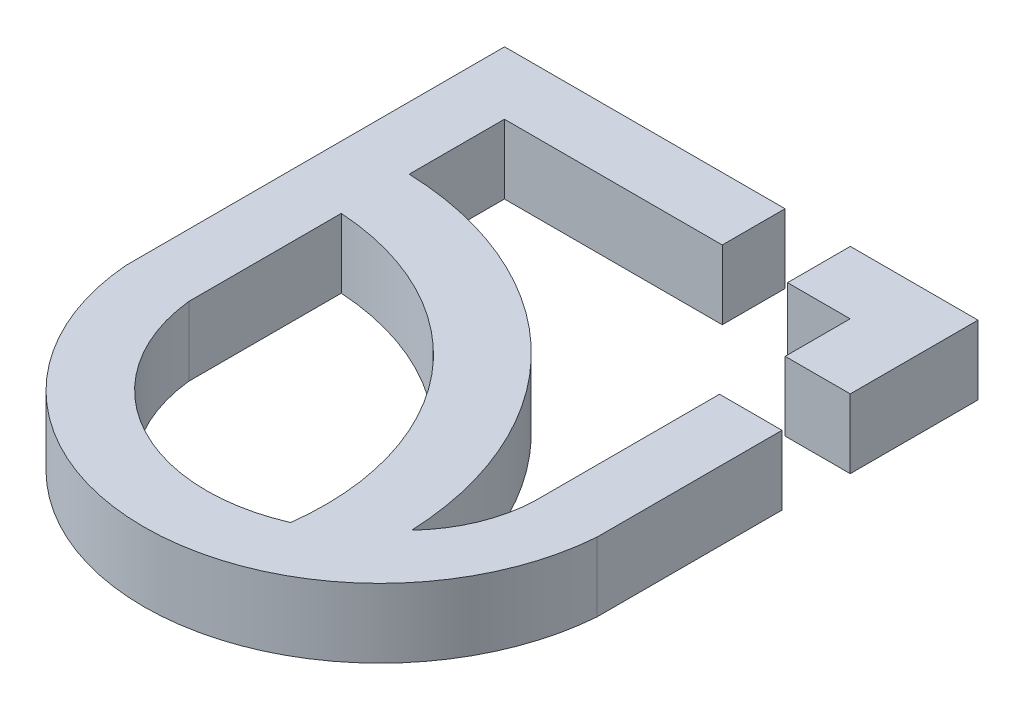
ISO-10303-21;
HEADER;
FILE_DESCRIPTION(('STEP AP214'),'2;1');
FILE_NAME('part.step','',(''),(''),'','','');
FILE_SCHEMA(('AUTOMOTIVE_DESIGN { 1 0 10303 214 1 1 1 1 }'));
ENDSEC;
DATA;
#1=APPLICATION_CONTEXT('core data for automotive mechanical design processes');
#2=APPLICATION_PROTOCOL_DEFINITION('international standard','automotive_design',2000,#1);
#3=PRODUCT_CONTEXT('',#1,'mechanical');
#4=PRODUCT('Part','Part','',(#3));
#5=PRODUCT_RELATED_PRODUCT_CATEGORY('part','',(#4));
#6=PRODUCT_DEFINITION_FORMATION('','',#4);
#7=PRODUCT_DEFINITION_CONTEXT('part definition',#1,'design');
#8=PRODUCT_DEFINITION('design','',#6,#7);
#9=PRODUCT_DEFINITION_SHAPE('','',#8);
#10=(LENGTH_UNIT() NAMED_UNIT(*) SI_UNIT(.MILLI.,.METRE.));
#11=(NAMED_UNIT(*) PLANE_ANGLE_UNIT() SI_UNIT($,.RADIAN.));
#12=(NAMED_UNIT(*) SI_UNIT($,.STERADIAN.) SOLID_ANGLE_UNIT());
#13=UNCERTAINTY_MEASURE_WITH_UNIT(LENGTH_MEASURE(1.E-05),#10,'distance_accuracy_value','');
#14=(GEOMETRIC_REPRESENTATION_CONTEXT(3) GLOBAL_UNCERTAINTY_ASSIGNED_CONTEXT((#13)) GLOBAL_UNIT_ASSIGNED_CONTEXT((#10,
#11,#12)) REPRESENTATION_CONTEXT('',''));
#15=CARTESIAN_POINT('',(0.,0.,0.));
#16=DIRECTION('',(0.,0.,1.));
#17=DIRECTION('',(1.,0.,0.));
#18=AXIS2_PLACEMENT_3D('',#15,#16,#17);
#19=CARTESIAN_POINT('',(127.017693124665,25.4,-195.999460881352));
#20=DIRECTION('',(1.,0.,0.));
#21=DIRECTION('',(0.,0.,-1.));
#22=AXIS2_PLACEMENT_3D('',#19,#20,#21);
#23=PLANE('',#22);
#24=DIRECTION('',(0.,0.,1.));
#25=VECTOR('',#24,1.);
#26=CARTESIAN_POINT('',(127.017693124665,0.,-195.999460881352));
#27=LINE('',#26,#25);
#28=CARTESIAN_POINT('',(127.017693124665,0.,-219.067642019415));
#29=VERTEX_POINT('',#28);
#30=CARTESIAN_POINT('',(127.017693124665,0.,-195.999460881352));
#31=VERTEX_POINT('',#30);
#32=EDGE_CURVE('E132',#29,#31,#27,.T.);
#33=ORIENTED_EDGE('',*,*,#32,.T.);
#34=DIRECTION('',(0.,-1.,0.));
#35=VECTOR('',#34,1.);
#36=CARTESIAN_POINT('',(127.017693124665,25.4,-195.999460881352));
#37=LINE('',#36,#35);
#38=CARTESIAN_POINT('',(127.017693124665,25.4,-195.999460881352));
#39=VERTEX_POINT('',#38);
#40=EDGE_CURVE('E12',#39,#31,#37,.T.);
#41=ORIENTED_EDGE('',*,*,#40,.F.);
#42=DIRECTION('',(0.,0.,1.));
#43=VECTOR('',#42,1.);
#44=CARTESIAN_POINT('',(127.017693124665,25.4,-195.999460881352));
#45=LINE('',#44,#43);
#46=CARTESIAN_POINT('',(127.017693124665,25.4,-219.067642019415));
#47=VERTEX_POINT('',#46);
#48=EDGE_CURVE('E142',#47,#39,#45,.T.);
#49=ORIENTED_EDGE('',*,*,#48,.F.);
#50=DIRECTION('',(0.,-1.,0.));
#51=VECTOR('',#50,1.);
#52=CARTESIAN_POINT('',(127.017693124665,25.4,-219.067642019415));
#53=LINE('',#52,#51);
#54=EDGE_CURVE('E128',#47,#29,#53,.T.);
#55=ORIENTED_EDGE('',*,*,#54,.T.);
#56=EDGE_LOOP('',(#33,#41,#49,#55));
#57=FACE_BOUND('',#56,.T.);
#58=ADVANCED_FACE('F48',(#57),#23,.F.);
#59=CARTESIAN_POINT('',(127.017693124665,25.4,-195.999460881352));
#60=DIRECTION('',(0.,0.,-1.));
#61=DIRECTION('',(-1.,0.,0.));
#62=AXIS2_PLACEMENT_3D('',#59,#60,#61);
#63=PLANE('',#62);
#64=DIRECTION('',(1.,0.,0.));
#65=VECTOR('',#64,1.);
#66=CARTESIAN_POINT('',(127.017693124665,0.,-195.999460881352));
#67=LINE('',#66,#65);
#68=CARTESIAN_POINT('',(150.026111112882,0.,-195.999460881352));
#69=VERTEX_POINT('',#68);
#70=EDGE_CURVE('E135',#31,#69,#67,.T.);
#71=ORIENTED_EDGE('',*,*,#70,.T.);
#72=DIRECTION('',(0.,-1.,0.));
#73=VECTOR('',#72,1.);
#74=CARTESIAN_POINT('',(150.026111112882,25.4,-195.999460881352));
#75=LINE('',#74,#73);
#76=CARTESIAN_POINT('',(150.026111112882,25.4,-195.999460881352));
#77=VERTEX_POINT('',#76);
#78=EDGE_CURVE('E56',#77,#69,#75,.T.);
#79=ORIENTED_EDGE('',*,*,#78,.F.);
#80=DIRECTION('',(1.,0.,0.));
#81=VECTOR('',#80,1.);
#82=CARTESIAN_POINT('',(127.017693124665,25.4,-195.999460881352));
#83=LINE('',#82,#81);
#84=EDGE_CURVE('E101',#39,#77,#83,.T.);
#85=ORIENTED_EDGE('',*,*,#84,.F.);
#86=ORIENTED_EDGE('',*,*,#40,.T.);
#87=EDGE_LOOP('',(#71,#79,#85,#86));
#88=FACE_BOUND('',#87,.T.);
#89=ADVANCED_FACE('F166',(#88),#63,.F.);
#90=CARTESIAN_POINT('',(150.026111112882,25.4,-172.13008551475));
#91=DIRECTION('',(1.,0.,0.));
#92=DIRECTION('',(0.,0.,-1.));
#93=AXIS2_PLACEMENT_3D('',#90,#91,#92);
#94=PLANE('',#93);
#95=DIRECTION('',(0.,0.,1.));
#96=VECTOR('',#95,1.);
#97=CARTESIAN_POINT('',(150.026111112882,0.,-172.13008551475));
#98=LINE('',#97,#96);
#99=CARTESIAN_POINT('',(150.026111112882,0.,-172.13008551475));
#100=VERTEX_POINT('',#99);
#101=EDGE_CURVE('E137',#69,#100,#98,.T.);
#102=ORIENTED_EDGE('',*,*,#101,.T.);
#103=DIRECTION('',(0.,-1.,0.));
#104=VECTOR('',#103,1.);
#105=CARTESIAN_POINT('',(150.026111112882,25.4,-172.13008551475));
#106=LINE('',#105,#104);
#107=CARTESIAN_POINT('',(150.026111112882,25.4,-172.13008551475));
#108=VERTEX_POINT('',#107);
#109=EDGE_CURVE('E123',#108,#100,#106,.T.);
#110=ORIENTED_EDGE('',*,*,#109,.F.);
#111=DIRECTION('',(0.,0.,1.));
#112=VECTOR('',#111,1.);
#113=CARTESIAN_POINT('',(150.026111112882,25.4,-172.13008551475));
#114=LINE('',#113,#112);
#115=EDGE_CURVE('E114',#77,#108,#114,.T.);
#116=ORIENTED_EDGE('',*,*,#115,.F.);
#117=ORIENTED_EDGE('',*,*,#78,.T.);
#118=EDGE_LOOP('',(#102,#110,#116,#117));
#119=FACE_BOUND('',#118,.T.);
#120=ADVANCED_FACE('F148',(#119),#94,.F.);
#121=CARTESIAN_POINT('',(173.927929859074,25.4,-172.13008551475));
#122=DIRECTION('',(0.,0.,-1.));
#123=DIRECTION('',(-1.,0.,0.));
#124=AXIS2_PLACEMENT_3D('',#121,#122,#123);
#125=PLANE('',#124);
#126=DIRECTION('',(1.,0.,0.));
#127=VECTOR('',#126,1.);
#128=CARTESIAN_POINT('',(173.927929859074,0.,-172.13008551475));
#129=LINE('',#128,#127);
#130=CARTESIAN_POINT('',(173.927929859074,0.,-172.13008551475));
#131=VERTEX_POINT('',#130);
#132=EDGE_CURVE('E122',#100,#131,#129,.T.);
#133=ORIENTED_EDGE('',*,*,#132,.T.);
#134=DIRECTION('',(0.,-1.,0.));
#135=VECTOR('',#134,1.);
#136=CARTESIAN_POINT('',(173.927929859074,25.4,-172.13008551475));
#137=LINE('',#136,#135);
#138=CARTESIAN_POINT('',(173.927929859074,25.4,-172.13008551475));
#139=VERTEX_POINT('',#138);
#140=EDGE_CURVE('E119',#139,#131,#137,.T.);
#141=ORIENTED_EDGE('',*,*,#140,.F.);
#142=DIRECTION('',(1.,0.,0.));
#143=VECTOR('',#142,1.);
#144=CARTESIAN_POINT('',(173.927929859074,25.4,-172.13008551475));
#145=LINE('',#144,#143);
#146=EDGE_CURVE('E108',#108,#139,#145,.T.);
#147=ORIENTED_EDGE('',*,*,#146,.F.);
#148=ORIENTED_EDGE('',*,*,#109,.T.);
#149=EDGE_LOOP('',(#133,#141,#147,#148));
#150=FACE_BOUND('',#149,.T.);
#151=ADVANCED_FACE('F120',(#150),#125,.F.);
#152=CARTESIAN_POINT('',(173.927929859074,25.4,-172.13008551475));
#153=DIRECTION('',(-1.,0.,0.));
#154=DIRECTION('',(0.,0.,1.));
#155=AXIS2_PLACEMENT_3D('',#152,#153,#154);
#156=PLANE('',#155);
#157=DIRECTION('',(0.,0.,-1.));
#158=VECTOR('',#157,1.);
#159=CARTESIAN_POINT('',(173.927929859074,0.,-172.13008551475));
#160=LINE('',#159,#158);
#161=CARTESIAN_POINT('',(173.927929859074,0.,-219.067642019415));
#162=VERTEX_POINT('',#161);
#163=EDGE_CURVE('E87',#131,#162,#160,.T.);
#164=ORIENTED_EDGE('',*,*,#163,.T.);
#165=DIRECTION('',(0.,-1.,0.));
#166=VECTOR('',#165,1.);
#167=CARTESIAN_POINT('',(173.927929859074,25.4,-219.067642019415));
#168=LINE('',#167,#166);
#169=CARTESIAN_POINT('',(173.927929859074,25.4,-219.067642019415));
#170=VERTEX_POINT('',#169);
#171=EDGE_CURVE('E124',#170,#162,#168,.T.);
#172=ORIENTED_EDGE('',*,*,#171,.F.);
#173=DIRECTION('',(0.,0.,-1.));
#174=VECTOR('',#173,1.);
#175=CARTESIAN_POINT('',(173.927929859074,25.4,-172.13008551475));
#176=LINE('',#175,#174);
#177=EDGE_CURVE('E112',#139,#170,#176,.T.);
#178=ORIENTED_EDGE('',*,*,#177,.F.);
#179=ORIENTED_EDGE('',*,*,#140,.T.);
#180=EDGE_LOOP('',(#164,#172,#178,#179));
#181=FACE_BOUND('',#180,.T.);
#182=ADVANCED_FACE('F126',(#181),#156,.F.);
#183=CARTESIAN_POINT('',(173.927929859074,25.4,-219.067642019415));
#184=DIRECTION('',(0.,0.,1.));
#185=DIRECTION('',(1.,0.,0.));
#186=AXIS2_PLACEMENT_3D('',#183,#184,#185);
#187=PLANE('',#186);
#188=DIRECTION('',(-1.,0.,0.));
#189=VECTOR('',#188,1.);
#190=CARTESIAN_POINT('',(173.927929859074,0.,-219.067642019415));
#191=LINE('',#190,#189);
#192=EDGE_CURVE('E93',#162,#29,#191,.T.);
#193=ORIENTED_EDGE('',*,*,#192,.T.);
#194=ORIENTED_EDGE('',*,*,#54,.F.);
#195=DIRECTION('',(-1.,0.,0.));
#196=VECTOR('',#195,1.);
#197=CARTESIAN_POINT('',(173.927929859074,25.4,-219.067642019415));
#198=LINE('',#197,#196);
#199=EDGE_CURVE('E64',#170,#47,#198,.T.);
#200=ORIENTED_EDGE('',*,*,#199,.F.);
#201=ORIENTED_EDGE('',*,*,#171,.T.);
#202=EDGE_LOOP('',(#193,#194,#200,#201));
#203=FACE_BOUND('',#202,.T.);
#204=ADVANCED_FACE('F155',(#203),#187,.F.);
#205=CARTESIAN_POINT('',(0.,25.4,0.));
#206=DIRECTION('',(0.,1.,0.));
#207=DIRECTION('',(0.,0.,1.));
#208=AXIS2_PLACEMENT_3D('',#205,#206,#207);
#209=PLANE('',#208);
#210=ORIENTED_EDGE('',*,*,#48,.T.);
#211=ORIENTED_EDGE('',*,*,#84,.T.);
#212=ORIENTED_EDGE('',*,*,#115,.T.);
#213=ORIENTED_EDGE('',*,*,#146,.T.);
#214=ORIENTED_EDGE('',*,*,#177,.T.);
#215=ORIENTED_EDGE('',*,*,#199,.T.);
#216=EDGE_LOOP('',(#210,#211,#212,#213,#214,#215));
#217=FACE_BOUND('',#216,.T.);
#218=ADVANCED_FACE('F110',(#217),#209,.T.);
#219=CARTESIAN_POINT('',(0.,0.,0.));
#220=DIRECTION('',(0.,1.,0.));
#221=DIRECTION('',(0.,0.,1.));
#222=AXIS2_PLACEMENT_3D('',#219,#220,#221);
#223=PLANE('',#222);
#224=ORIENTED_EDGE('',*,*,#32,.F.);
#225=ORIENTED_EDGE('',*,*,#192,.F.);
#226=ORIENTED_EDGE('',*,*,#163,.F.);
#227=ORIENTED_EDGE('',*,*,#132,.F.);
#228=ORIENTED_EDGE('',*,*,#101,.F.);
#229=ORIENTED_EDGE('',*,*,#70,.F.);
#230=EDGE_LOOP('',(#224,#225,#226,#227,#228,#229));
#231=FACE_BOUND('',#230,.T.);
#232=ADVANCED_FACE('F151',(#231),#223,.F.);
#233=CLOSED_SHELL('',(#58,#89,#120,#151,#182,#204,#218,#232));
#234=MANIFOLD_SOLID_BREP('B2',#233);
#235=CARTESIAN_POINT('',(86.487166974426,25.4,-86.7884043944306));
#236=DIRECTION('',(0.,1.,0.));
#237=DIRECTION('',(0.,0.,1.));
#238=AXIS2_PLACEMENT_3D('',#235,#236,#237);
#239=PLANE('',#238);
#240=CARTESIAN_POINT('',(86.487166974426,25.4,-86.7884043944306));
#241=DIRECTION('',(0.,1.,0.));
#242=DIRECTION('',(0.,0.,1.));
#243=AXIS2_PLACEMENT_3D('',#240,#241,#242);
#244=CIRCLE('',#243,86.7510147431322);
#245=CARTESIAN_POINT('',(0.,25.4,-80.0275976599587));
#246=VERTEX_POINT('',#245);
#247=CARTESIAN_POINT('',(172.974333948852,25.4,-80.0275976599587));
#248=VERTEX_POINT('',#247);
#249=EDGE_CURVE('E361',#246,#248,#244,.T.);
#250=ORIENTED_EDGE('',*,*,#249,.T.);
#251=DIRECTION('',(0.,0.,-1.));
#252=VECTOR('',#251,1.);
#253=CARTESIAN_POINT('',(172.974333948852,25.4,-80.0275976599587));
#254=LINE('',#253,#252);
#255=CARTESIAN_POINT('',(172.974333948852,25.4,-148.011746995585));
#256=VERTEX_POINT('',#255);
#257=EDGE_CURVE('E365',#248,#256,#254,.T.);
#258=ORIENTED_EDGE('',*,*,#257,.T.);
#259=DIRECTION('',(-1.,0.,0.));
#260=VECTOR('',#259,1.);
#261=CARTESIAN_POINT('',(150.026111112882,25.4,-148.011746995585));
#262=LINE('',#261,#260);
#263=CARTESIAN_POINT('',(150.026111112882,25.4,-148.011746995585));
#264=VERTEX_POINT('',#263);
#265=EDGE_CURVE('E369',#256,#264,#262,.T.);
#266=ORIENTED_EDGE('',*,*,#265,.T.);
#267=DIRECTION('',(0.,0.,1.));
#268=VECTOR('',#267,1.);
#269=CARTESIAN_POINT('',(150.026111112882,25.4,-80.0275976599587));
#270=LINE('',#269,#268);
#271=CARTESIAN_POINT('',(150.026111112882,25.4,-80.0275976599587));
#272=VERTEX_POINT('',#271);
#273=EDGE_CURVE('E372',#264,#272,#270,.T.);
#274=ORIENTED_EDGE('',*,*,#273,.T.);
#275=CARTESIAN_POINT('',(101.122321747501,25.4,-81.7614654621829));
#276=DIRECTION('',(0.,-1.,0.));
#277=DIRECTION('',(0.,0.,1.));
#278=AXIS2_PLACEMENT_3D('',#275,#276,#277);
#279=CIRCLE('',#278,48.9345165690762);
#280=CARTESIAN_POINT('',(136.744902109116,25.4,-48.2112243269925));
#281=VERTEX_POINT('',#280);
#282=EDGE_CURVE('E375',#272,#281,#279,.T.);
#283=ORIENTED_EDGE('',*,*,#282,.T.);
#284=CARTESIAN_POINT('',(18.985182842922,25.4,-43.2164154029401));
#285=DIRECTION('',(0.,1.,0.));
#286=DIRECTION('',(0.,0.,-1.));
#287=AXIS2_PLACEMENT_3D('',#284,#285,#286);
#288=CIRCLE('',#287,117.865599722059);
#289=CARTESIAN_POINT('',(23.0118290964539,25.4,-161.013213822038));
#290=VERTEX_POINT('',#289);
#291=EDGE_CURVE('E378',#281,#290,#288,.T.);
#292=ORIENTED_EDGE('',*,*,#291,.T.);
#293=DIRECTION('',(0.,0.,-1.));
#294=VECTOR('',#293,1.);
#295=CARTESIAN_POINT('',(23.0118290964539,25.4,-195.999460881352));
#296=LINE('',#295,#294);
#297=CARTESIAN_POINT('',(23.0118290964539,25.4,-195.999460881352));
#298=VERTEX_POINT('',#297);
#299=EDGE_CURVE('E381',#290,#298,#296,.T.);
#300=ORIENTED_EDGE('',*,*,#299,.T.);
#301=DIRECTION('',(1.,0.,0.));
#302=VECTOR('',#301,1.);
#303=CARTESIAN_POINT('',(103.040086397792,25.4,-195.999460881352));
#304=LINE('',#303,#302);
#305=CARTESIAN_POINT('',(103.040086397792,25.4,-195.999460881352));
#306=VERTEX_POINT('',#305);
#307=EDGE_CURVE('E384',#298,#306,#304,.T.);
#308=ORIENTED_EDGE('',*,*,#307,.T.);
#309=DIRECTION('',(0.,0.,-1.));
#310=VECTOR('',#309,1.);
#311=CARTESIAN_POINT('',(103.040086397792,25.4,-219.067642019415));
#312=LINE('',#311,#310);
#313=CARTESIAN_POINT('',(103.040086397792,25.4,-219.067642019415));
#314=VERTEX_POINT('',#313);
#315=EDGE_CURVE('E387',#306,#314,#312,.T.);
#316=ORIENTED_EDGE('',*,*,#315,.T.);
#317=DIRECTION('',(-1.,0.,0.));
#318=VECTOR('',#317,1.);
#319=CARTESIAN_POINT('',(0.,25.4,-219.067642019415));
#320=LINE('',#319,#318);
#321=CARTESIAN_POINT('',(0.,25.4,-219.067642019415));
#322=VERTEX_POINT('',#321);
#323=EDGE_CURVE('E390',#314,#322,#320,.T.);
#324=ORIENTED_EDGE('',*,*,#323,.T.);
#325=DIRECTION('',(0.,0.,1.));
#326=VECTOR('',#325,1.);
#327=CARTESIAN_POINT('',(0.,25.4,-80.0275976599587));
#328=LINE('',#327,#326);
#329=EDGE_CURVE('E393',#322,#246,#328,.T.);
#330=ORIENTED_EDGE('',*,*,#329,.T.);
#331=EDGE_LOOP('',(#250,#258,#266,#274,#283,#292,#300,#308,#316,#324,#330));
#332=FACE_BOUND('',#331,.T.);
#333=CARTESIAN_POINT('',(17.0299038346586,25.4,-40.4491483280348));
#334=DIRECTION('',(0.,1.,0.));
#335=DIRECTION('',(0.,0.,-1.));
#336=AXIS2_PLACEMENT_3D('',#333,#334,#335);
#337=CIRCLE('',#336,95.7959850405439);
#338=CARTESIAN_POINT('',(112.066438028889,25.4,-28.4105471536038));
#339=VERTEX_POINT('',#338);
#340=CARTESIAN_POINT('',(23.0118290964539,25.4,-136.058182001901));
#341=VERTEX_POINT('',#340);
#342=EDGE_CURVE('E334',#339,#341,#337,.T.);
#343=ORIENTED_EDGE('',*,*,#342,.F.);
#344=CARTESIAN_POINT('',(86.518970104668,25.4,-86.964878381126));
#345=DIRECTION('',(0.,1.,0.));
#346=DIRECTION('',(0.,0.,1.));
#347=AXIS2_PLACEMENT_3D('',#344,#345,#346);
#348=CIRCLE('',#347,63.8849185867954);
#349=CARTESIAN_POINT('',(23.0118290964539,25.4,-80.0275976599587));
#350=VERTEX_POINT('',#349);
#351=EDGE_CURVE('E325',#350,#339,#348,.T.);
#352=ORIENTED_EDGE('',*,*,#351,.F.);
#353=DIRECTION('',(0.,0.,1.));
#354=VECTOR('',#353,1.);
#355=CARTESIAN_POINT('',(23.0118290964539,25.4,-136.058182001901));
#356=LINE('',#355,#354);
#357=EDGE_CURVE('E344',#341,#350,#356,.T.);
#358=ORIENTED_EDGE('',*,*,#357,.F.);
#359=EDGE_LOOP('',(#343,#352,#358));
#360=FACE_BOUND('',#359,.T.);
#361=ADVANCED_FACE('F223',(#332,#360),#239,.T.);
#362=CARTESIAN_POINT('',(86.487166974426,0.,-86.7884043944306));
#363=DIRECTION('',(0.,1.,0.));
#364=DIRECTION('',(0.,0.,1.));
#365=AXIS2_PLACEMENT_3D('',#362,#363,#364);
#366=PLANE('',#365);
#367=CARTESIAN_POINT('',(86.487166974426,0.,-86.7884043944306));
#368=DIRECTION('',(0.,1.,0.));
#369=DIRECTION('',(0.,0.,1.));
#370=AXIS2_PLACEMENT_3D('',#367,#368,#369);
#371=CIRCLE('',#370,86.7510147431322);
#372=CARTESIAN_POINT('',(0.,0.,-80.0275976599587));
#373=VERTEX_POINT('',#372);
#374=CARTESIAN_POINT('',(172.974333948852,0.,-80.0275976599587));
#375=VERTEX_POINT('',#374);
#376=EDGE_CURVE('E342',#373,#375,#371,.T.);
#377=ORIENTED_EDGE('',*,*,#376,.F.);
#378=DIRECTION('',(0.,0.,1.));
#379=VECTOR('',#378,1.);
#380=CARTESIAN_POINT('',(0.,0.,-80.0275976599587));
#381=LINE('',#380,#379);
#382=CARTESIAN_POINT('',(0.,0.,-219.067642019415));
#383=VERTEX_POINT('',#382);
#384=EDGE_CURVE('E366',#383,#373,#381,.T.);
#385=ORIENTED_EDGE('',*,*,#384,.F.);
#386=DIRECTION('',(-1.,0.,0.));
#387=VECTOR('',#386,1.);
#388=CARTESIAN_POINT('',(0.,0.,-219.067642019415));
#389=LINE('',#388,#387);
#390=CARTESIAN_POINT('',(103.040086397792,0.,-219.067642019415));
#391=VERTEX_POINT('',#390);
#392=EDGE_CURVE('E424',#391,#383,#389,.T.);
#393=ORIENTED_EDGE('',*,*,#392,.F.);
#394=DIRECTION('',(0.,0.,-1.));
#395=VECTOR('',#394,1.);
#396=CARTESIAN_POINT('',(103.040086397792,0.,-219.067642019415));
#397=LINE('',#396,#395);
#398=CARTESIAN_POINT('',(103.040086397792,0.,-195.999460881352));
#399=VERTEX_POINT('',#398);
#400=EDGE_CURVE('E421',#399,#391,#397,.T.);
#401=ORIENTED_EDGE('',*,*,#400,.F.);
#402=DIRECTION('',(1.,0.,0.));
#403=VECTOR('',#402,1.);
#404=CARTESIAN_POINT('',(103.040086397792,0.,-195.999460881352));
#405=LINE('',#404,#403);
#406=CARTESIAN_POINT('',(23.0118290964539,0.,-195.999460881352));
#407=VERTEX_POINT('',#406);
#408=EDGE_CURVE('E418',#407,#399,#405,.T.);
#409=ORIENTED_EDGE('',*,*,#408,.F.);
#410=DIRECTION('',(0.,0.,-1.));
#411=VECTOR('',#410,1.);
#412=CARTESIAN_POINT('',(23.0118290964539,0.,-195.999460881352));
#413=LINE('',#412,#411);
#414=CARTESIAN_POINT('',(23.0118290964539,0.,-161.013213822038));
#415=VERTEX_POINT('',#414);
#416=EDGE_CURVE('E415',#415,#407,#413,.T.);
#417=ORIENTED_EDGE('',*,*,#416,.F.);
#418=CARTESIAN_POINT('',(18.985182842922,0.,-43.2164154029401));
#419=DIRECTION('',(0.,1.,0.));
#420=DIRECTION('',(0.,0.,-1.));
#421=AXIS2_PLACEMENT_3D('',#418,#419,#420);
#422=CIRCLE('',#421,117.865599722059);
#423=CARTESIAN_POINT('',(136.744902109116,0.,-48.2112243269925));
#424=VERTEX_POINT('',#423);
#425=EDGE_CURVE('E412',#424,#415,#422,.T.);
#426=ORIENTED_EDGE('',*,*,#425,.F.);
#427=CARTESIAN_POINT('',(101.122321747501,0.,-81.7614654621829));
#428=DIRECTION('',(0.,-1.,0.));
#429=DIRECTION('',(0.,0.,1.));
#430=AXIS2_PLACEMENT_3D('',#427,#428,#429);
#431=CIRCLE('',#430,48.9345165690762);
#432=CARTESIAN_POINT('',(150.026111112882,0.,-80.0275976599587));
#433=VERTEX_POINT('',#432);
#434=EDGE_CURVE('E409',#433,#424,#431,.T.);
#435=ORIENTED_EDGE('',*,*,#434,.F.);
#436=DIRECTION('',(0.,0.,1.));
#437=VECTOR('',#436,1.);
#438=CARTESIAN_POINT('',(150.026111112882,0.,-80.0275976599587));
#439=LINE('',#438,#437);
#440=CARTESIAN_POINT('',(150.026111112882,0.,-148.011746995585));
#441=VERTEX_POINT('',#440);
#442=EDGE_CURVE('E406',#441,#433,#439,.T.);
#443=ORIENTED_EDGE('',*,*,#442,.F.);
#444=DIRECTION('',(-1.,0.,0.));
#445=VECTOR('',#444,1.);
#446=CARTESIAN_POINT('',(150.026111112882,0.,-148.011746995585));
#447=LINE('',#446,#445);
#448=CARTESIAN_POINT('',(172.974333948852,0.,-148.011746995585));
#449=VERTEX_POINT('',#448);
#450=EDGE_CURVE('E403',#449,#441,#447,.T.);
#451=ORIENTED_EDGE('',*,*,#450,.F.);
#452=DIRECTION('',(0.,0.,-1.));
#453=VECTOR('',#452,1.);
#454=CARTESIAN_POINT('',(172.974333948852,0.,-80.0275976599587));
#455=LINE('',#454,#453);
#456=EDGE_CURVE('E400',#375,#449,#455,.T.);
#457=ORIENTED_EDGE('',*,*,#456,.F.);
#458=EDGE_LOOP('',(#377,#385,#393,#401,#409,#417,#426,#435,#443,#451,#457));
#459=FACE_BOUND('',#458,.T.);
#460=CARTESIAN_POINT('',(86.518970104668,0.,-86.964878381126));
#461=DIRECTION('',(0.,1.,0.));
#462=DIRECTION('',(0.,0.,1.));
#463=AXIS2_PLACEMENT_3D('',#460,#461,#462);
#464=CIRCLE('',#463,63.8849185867954);
#465=CARTESIAN_POINT('',(23.0118290964539,0.,-80.0275976599587));
#466=VERTEX_POINT('',#465);
#467=CARTESIAN_POINT('',(112.066438028889,0.,-28.4105471536038));
#468=VERTEX_POINT('',#467);
#469=EDGE_CURVE('E247',#466,#468,#464,.T.);
#470=ORIENTED_EDGE('',*,*,#469,.T.);
#471=CARTESIAN_POINT('',(17.0299038346586,0.,-40.4491483280348));
#472=DIRECTION('',(0.,1.,0.));
#473=DIRECTION('',(0.,0.,-1.));
#474=AXIS2_PLACEMENT_3D('',#471,#472,#473);
#475=CIRCLE('',#474,95.7959850405439);
#476=CARTESIAN_POINT('',(23.0118290964539,0.,-136.058182001901));
#477=VERTEX_POINT('',#476);
#478=EDGE_CURVE('E340',#468,#477,#475,.T.);
#479=ORIENTED_EDGE('',*,*,#478,.T.);
#480=DIRECTION('',(0.,0.,1.));
#481=VECTOR('',#480,1.);
#482=CARTESIAN_POINT('',(23.0118290964539,0.,-136.058182001901));
#483=LINE('',#482,#481);
#484=EDGE_CURVE('E335',#477,#466,#483,.T.);
#485=ORIENTED_EDGE('',*,*,#484,.T.);
#486=EDGE_LOOP('',(#470,#479,#485));
#487=FACE_BOUND('',#486,.T.);
#488=ADVANCED_FACE('F475',(#459,#487),#366,.F.);
#489=CARTESIAN_POINT('',(86.487166974426,25.4,-86.7884043944306));
#490=DIRECTION('',(0.,-1.,0.));
#491=DIRECTION('',(0.,0.,-1.));
#492=AXIS2_PLACEMENT_3D('',#489,#490,#491);
#493=CYLINDRICAL_SURFACE('',#492,86.7510147431322);
#494=ORIENTED_EDGE('',*,*,#376,.T.);
#495=DIRECTION('',(0.,-1.,0.));
#496=VECTOR('',#495,1.);
#497=CARTESIAN_POINT('',(172.974333948852,25.4,-80.0275976599587));
#498=LINE('',#497,#496);
#499=EDGE_CURVE('E46',#248,#375,#498,.T.);
#500=ORIENTED_EDGE('',*,*,#499,.F.);
#501=ORIENTED_EDGE('',*,*,#249,.F.);
#502=DIRECTION('',(0.,-1.,0.));
#503=VECTOR('',#502,1.);
#504=CARTESIAN_POINT('',(0.,25.4,-80.0275976599587));
#505=LINE('',#504,#503);
#506=EDGE_CURVE('E396',#246,#373,#505,.T.);
#507=ORIENTED_EDGE('',*,*,#506,.T.);
#508=EDGE_LOOP('',(#494,#500,#501,#507));
#509=FACE_BOUND('',#508,.T.);
#510=ADVANCED_FACE('F225',(#509),#493,.T.);
#511=CARTESIAN_POINT('',(172.974333948852,25.4,-80.0275976599587));
#512=DIRECTION('',(-1.,0.,0.));
#513=DIRECTION('',(0.,0.,1.));
#514=AXIS2_PLACEMENT_3D('',#511,#512,#513);
#515=PLANE('',#514);
#516=ORIENTED_EDGE('',*,*,#456,.T.);
#517=DIRECTION('',(0.,-1.,0.));
#518=VECTOR('',#517,1.);
#519=CARTESIAN_POINT('',(172.974333948852,25.4,-148.011746995585));
#520=LINE('',#519,#518);
#521=EDGE_CURVE('E232',#256,#449,#520,.T.);
#522=ORIENTED_EDGE('',*,*,#521,.F.);
#523=ORIENTED_EDGE('',*,*,#257,.F.);
#524=ORIENTED_EDGE('',*,*,#499,.T.);
#525=EDGE_LOOP('',(#516,#522,#523,#524));
#526=FACE_BOUND('',#525,.T.);
#527=ADVANCED_FACE('F492',(#526),#515,.F.);
#528=CARTESIAN_POINT('',(150.026111112882,25.4,-148.011746995585));
#529=DIRECTION('',(0.,0.,1.));
#530=DIRECTION('',(1.,0.,0.));
#531=AXIS2_PLACEMENT_3D('',#528,#529,#530);
#532=PLANE('',#531);
#533=ORIENTED_EDGE('',*,*,#450,.T.);
#534=DIRECTION('',(0.,-1.,0.));
#535=VECTOR('',#534,1.);
#536=CARTESIAN_POINT('',(150.026111112882,25.4,-148.011746995585));
#537=LINE('',#536,#535);
#538=EDGE_CURVE('E460',#264,#441,#537,.T.);
#539=ORIENTED_EDGE('',*,*,#538,.F.);
#540=ORIENTED_EDGE('',*,*,#265,.F.);
#541=ORIENTED_EDGE('',*,*,#521,.T.);
#542=EDGE_LOOP('',(#533,#539,#540,#541));
#543=FACE_BOUND('',#542,.T.);
#544=ADVANCED_FACE('F469',(#543),#532,.F.);
#545=CARTESIAN_POINT('',(150.026111112882,25.4,-80.0275976599587));
#546=DIRECTION('',(1.,0.,0.));
#547=DIRECTION('',(0.,0.,-1.));
#548=AXIS2_PLACEMENT_3D('',#545,#546,#547);
#549=PLANE('',#548);
#550=ORIENTED_EDGE('',*,*,#442,.T.);
#551=DIRECTION('',(0.,-1.,0.));
#552=VECTOR('',#551,1.);
#553=CARTESIAN_POINT('',(150.026111112882,25.4,-80.0275976599587));
#554=LINE('',#553,#552);
#555=EDGE_CURVE('E456',#272,#433,#554,.T.);
#556=ORIENTED_EDGE('',*,*,#555,.F.);
#557=ORIENTED_EDGE('',*,*,#273,.F.);
#558=ORIENTED_EDGE('',*,*,#538,.T.);
#559=EDGE_LOOP('',(#550,#556,#557,#558));
#560=FACE_BOUND('',#559,.T.);
#561=ADVANCED_FACE('F481',(#560),#549,.F.);
#562=CARTESIAN_POINT('',(101.122321747501,25.4,-81.7614654621829));
#563=DIRECTION('',(0.,-1.,0.));
#564=DIRECTION('',(0.,0.,-1.));
#565=AXIS2_PLACEMENT_3D('',#562,#563,#564);
#566=CYLINDRICAL_SURFACE('',#565,48.9345165690762);
#567=ORIENTED_EDGE('',*,*,#434,.T.);
#568=DIRECTION('',(0.,-1.,0.));
#569=VECTOR('',#568,1.);
#570=CARTESIAN_POINT('',(136.744902109116,25.4,-48.2112243269925));
#571=LINE('',#570,#569);
#572=EDGE_CURVE('E452',#281,#424,#571,.T.);
#573=ORIENTED_EDGE('',*,*,#572,.F.);
#574=ORIENTED_EDGE('',*,*,#282,.F.);
#575=ORIENTED_EDGE('',*,*,#555,.T.);
#576=EDGE_LOOP('',(#567,#573,#574,#575));
#577=FACE_BOUND('',#576,.T.);
#578=ADVANCED_FACE('F485',(#577),#566,.F.);
#579=CARTESIAN_POINT('',(18.985182842922,25.4,-43.2164154029401));
#580=DIRECTION('',(0.,-1.,0.));
#581=DIRECTION('',(0.,0.,-1.));
#582=AXIS2_PLACEMENT_3D('',#579,#580,#581);
#583=CYLINDRICAL_SURFACE('',#582,117.865599722059);
#584=ORIENTED_EDGE('',*,*,#425,.T.);
#585=DIRECTION('',(0.,-1.,0.));
#586=VECTOR('',#585,1.);
#587=CARTESIAN_POINT('',(23.0118290964539,25.4,-161.013213822038));
#588=LINE('',#587,#586);
#589=EDGE_CURVE('E448',#290,#415,#588,.T.);
#590=ORIENTED_EDGE('',*,*,#589,.F.);
#591=ORIENTED_EDGE('',*,*,#291,.F.);
#592=ORIENTED_EDGE('',*,*,#572,.T.);
#593=EDGE_LOOP('',(#584,#590,#591,#592));
#594=FACE_BOUND('',#593,.T.);
#595=ADVANCED_FACE('F520',(#594),#583,.T.);
#596=CARTESIAN_POINT('',(23.0118290964539,25.4,-195.999460881352));
#597=DIRECTION('',(-1.,0.,0.));
#598=DIRECTION('',(0.,0.,1.));
#599=AXIS2_PLACEMENT_3D('',#596,#597,#598);
#600=PLANE('',#599);
#601=ORIENTED_EDGE('',*,*,#416,.T.);
#602=DIRECTION('',(0.,-1.,0.));
#603=VECTOR('',#602,1.);
#604=CARTESIAN_POINT('',(23.0118290964539,25.4,-195.999460881352));
#605=LINE('',#604,#603);
#606=EDGE_CURVE('E444',#298,#407,#605,.T.);
#607=ORIENTED_EDGE('',*,*,#606,.F.);
#608=ORIENTED_EDGE('',*,*,#299,.F.);
#609=ORIENTED_EDGE('',*,*,#589,.T.);
#610=EDGE_LOOP('',(#601,#607,#608,#609));
#611=FACE_BOUND('',#610,.T.);
#612=ADVANCED_FACE('F518',(#611),#600,.F.);
#613=CARTESIAN_POINT('',(103.040086397792,25.4,-195.999460881352));
#614=DIRECTION('',(0.,0.,-1.));
#615=DIRECTION('',(-1.,0.,0.));
#616=AXIS2_PLACEMENT_3D('',#613,#614,#615);
#617=PLANE('',#616);
#618=ORIENTED_EDGE('',*,*,#408,.T.);
#619=DIRECTION('',(0.,-1.,0.));
#620=VECTOR('',#619,1.);
#621=CARTESIAN_POINT('',(103.040086397792,25.4,-195.999460881352));
#622=LINE('',#621,#620);
#623=EDGE_CURVE('E440',#306,#399,#622,.T.);
#624=ORIENTED_EDGE('',*,*,#623,.F.);
#625=ORIENTED_EDGE('',*,*,#307,.F.);
#626=ORIENTED_EDGE('',*,*,#606,.T.);
#627=EDGE_LOOP('',(#618,#624,#625,#626));
#628=FACE_BOUND('',#627,.T.);
#629=ADVANCED_FACE('F513',(#628),#617,.F.);
#630=CARTESIAN_POINT('',(103.040086397792,25.4,-219.067642019415));
#631=DIRECTION('',(-1.,0.,0.));
#632=DIRECTION('',(0.,0.,1.));
#633=AXIS2_PLACEMENT_3D('',#630,#631,#632);
#634=PLANE('',#633);
#635=ORIENTED_EDGE('',*,*,#400,.T.);
#636=DIRECTION('',(0.,-1.,0.));
#637=VECTOR('',#636,1.);
#638=CARTESIAN_POINT('',(103.040086397792,25.4,-219.067642019415));
#639=LINE('',#638,#637);
#640=EDGE_CURVE('E436',#314,#391,#639,.T.);
#641=ORIENTED_EDGE('',*,*,#640,.F.);
#642=ORIENTED_EDGE('',*,*,#315,.F.);
#643=ORIENTED_EDGE('',*,*,#623,.T.);
#644=EDGE_LOOP('',(#635,#641,#642,#643));
#645=FACE_BOUND('',#644,.T.);
#646=ADVANCED_FACE('F508',(#645),#634,.F.);
#647=CARTESIAN_POINT('',(0.,25.4,-219.067642019415));
#648=DIRECTION('',(0.,0.,1.));
#649=DIRECTION('',(1.,0.,0.));
#650=AXIS2_PLACEMENT_3D('',#647,#648,#649);
#651=PLANE('',#650);
#652=ORIENTED_EDGE('',*,*,#392,.T.);
#653=DIRECTION('',(0.,-1.,0.));
#654=VECTOR('',#653,1.);
#655=CARTESIAN_POINT('',(0.,25.4,-219.067642019415));
#656=LINE('',#655,#654);
#657=EDGE_CURVE('E432',#322,#383,#656,.T.);
#658=ORIENTED_EDGE('',*,*,#657,.F.);
#659=ORIENTED_EDGE('',*,*,#323,.F.);
#660=ORIENTED_EDGE('',*,*,#640,.T.);
#661=EDGE_LOOP('',(#652,#658,#659,#660));
#662=FACE_BOUND('',#661,.T.);
#663=ADVANCED_FACE('F504',(#662),#651,.F.);
#664=CARTESIAN_POINT('',(0.,25.4,-80.0275976599587));
#665=DIRECTION('',(1.,0.,0.));
#666=DIRECTION('',(0.,0.,-1.));
#667=AXIS2_PLACEMENT_3D('',#664,#665,#666);
#668=PLANE('',#667);
#669=ORIENTED_EDGE('',*,*,#384,.T.);
#670=ORIENTED_EDGE('',*,*,#506,.F.);
#671=ORIENTED_EDGE('',*,*,#329,.F.);
#672=ORIENTED_EDGE('',*,*,#657,.T.);
#673=EDGE_LOOP('',(#669,#670,#671,#672));
#674=FACE_BOUND('',#673,.T.);
#675=ADVANCED_FACE('F499',(#674),#668,.F.);
#676=CARTESIAN_POINT('',(86.518970104668,25.4,-86.964878381126));
#677=DIRECTION('',(0.,-1.,0.));
#678=DIRECTION('',(0.,0.,-1.));
#679=AXIS2_PLACEMENT_3D('',#676,#677,#678);
#680=CYLINDRICAL_SURFACE('',#679,63.8849185867954);
#681=ORIENTED_EDGE('',*,*,#469,.F.);
#682=DIRECTION('',(0.,-1.,0.));
#683=VECTOR('',#682,1.);
#684=CARTESIAN_POINT('',(23.0118290964539,25.4,-80.0275976599587));
#685=LINE('',#684,#683);
#686=EDGE_CURVE('E329',#350,#466,#685,.T.);
#687=ORIENTED_EDGE('',*,*,#686,.F.);
#688=ORIENTED_EDGE('',*,*,#351,.T.);
#689=DIRECTION('',(0.,-1.,0.));
#690=VECTOR('',#689,1.);
#691=CARTESIAN_POINT('',(112.066438028889,25.4,-28.4105471536038));
#692=LINE('',#691,#690);
#693=EDGE_CURVE('E328',#339,#468,#692,.T.);
#694=ORIENTED_EDGE('',*,*,#693,.T.);
#695=EDGE_LOOP('',(#681,#687,#688,#694));
#696=FACE_BOUND('',#695,.T.);
#697=ADVANCED_FACE('F327',(#696),#680,.F.);
#698=CARTESIAN_POINT('',(17.0299038346586,25.4,-40.4491483280348));
#699=DIRECTION('',(0.,-1.,0.));
#700=DIRECTION('',(0.,0.,-1.));
#701=AXIS2_PLACEMENT_3D('',#698,#699,#700);
#702=CYLINDRICAL_SURFACE('',#701,95.7959850405439);
#703=ORIENTED_EDGE('',*,*,#478,.F.);
#704=ORIENTED_EDGE('',*,*,#693,.F.);
#705=ORIENTED_EDGE('',*,*,#342,.T.);
#706=DIRECTION('',(0.,-1.,0.));
#707=VECTOR('',#706,1.);
#708=CARTESIAN_POINT('',(23.0118290964539,25.4,-136.058182001901));
#709=LINE('',#708,#707);
#710=EDGE_CURVE('E239',#341,#477,#709,.T.);
#711=ORIENTED_EDGE('',*,*,#710,.T.);
#712=EDGE_LOOP('',(#703,#704,#705,#711));
#713=FACE_BOUND('',#712,.T.);
#714=ADVANCED_FACE('F338',(#713),#702,.F.);
#715=CARTESIAN_POINT('',(23.0118290964539,25.4,-136.058182001901));
#716=DIRECTION('',(1.,0.,0.));
#717=DIRECTION('',(0.,0.,-1.));
#718=AXIS2_PLACEMENT_3D('',#715,#716,#717);
#719=PLANE('',#718);
#720=ORIENTED_EDGE('',*,*,#484,.F.);
#721=ORIENTED_EDGE('',*,*,#710,.F.);
#722=ORIENTED_EDGE('',*,*,#357,.T.);
#723=ORIENTED_EDGE('',*,*,#686,.T.);
#724=EDGE_LOOP('',(#720,#721,#722,#723));
#725=FACE_BOUND('',#724,.T.);
#726=ADVANCED_FACE('F572',(#725),#719,.T.);
#727=CLOSED_SHELL('',(#361,#488,#510,#527,#544,#561,#578,#595,#612,#629,#646,#663,#675,#697,
#714,#726));
#728=MANIFOLD_SOLID_BREP('B6',#727);
#729=ADVANCED_BREP_SHAPE_REPRESENTATION('',(#18,#234,#728),#14);
#730=SHAPE_DEFINITION_REPRESENTATION(#9,#729);
ENDSEC;
END-ISO-10303-21;
